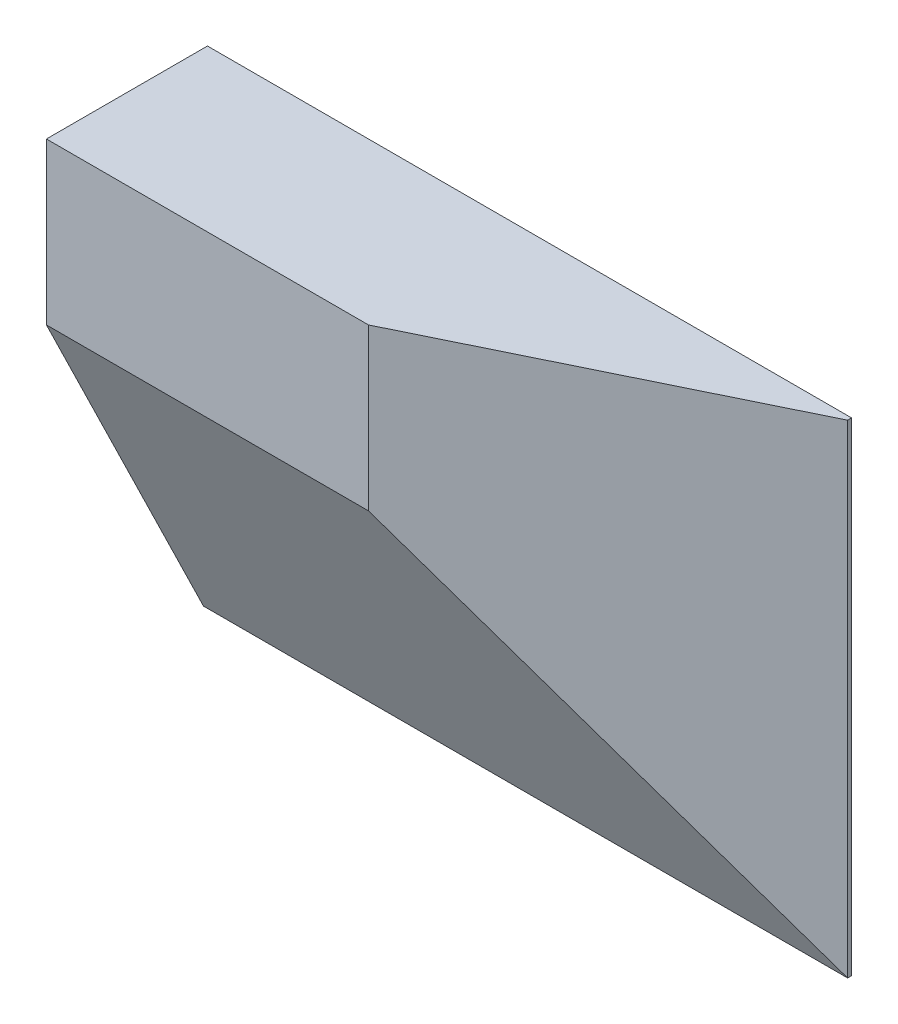
ISO-10303-21;
HEADER;
FILE_DESCRIPTION(('STEP AP214'),'2;1');
FILE_NAME('part.step','',(''),(''),'','','');
FILE_SCHEMA(('AUTOMOTIVE_DESIGN { 1 0 10303 214 1 1 1 1 }'));
ENDSEC;
DATA;
#1=APPLICATION_CONTEXT('core data for automotive mechanical design processes');
#2=APPLICATION_PROTOCOL_DEFINITION('international standard','automotive_design',2000,#1);
#3=PRODUCT_CONTEXT('',#1,'mechanical');
#4=PRODUCT('Part','Part','',(#3));
#5=PRODUCT_RELATED_PRODUCT_CATEGORY('part','',(#4));
#6=PRODUCT_DEFINITION_FORMATION('','',#4);
#7=PRODUCT_DEFINITION_CONTEXT('part definition',#1,'design');
#8=PRODUCT_DEFINITION('design','',#6,#7);
#9=PRODUCT_DEFINITION_SHAPE('','',#8);
#10=(LENGTH_UNIT() NAMED_UNIT(*) SI_UNIT(.MILLI.,.METRE.));
#11=(NAMED_UNIT(*) PLANE_ANGLE_UNIT() SI_UNIT($,.RADIAN.));
#12=(NAMED_UNIT(*) SI_UNIT($,.STERADIAN.) SOLID_ANGLE_UNIT());
#13=UNCERTAINTY_MEASURE_WITH_UNIT(LENGTH_MEASURE(1.E-05),#10,'distance_accuracy_value','');
#14=(GEOMETRIC_REPRESENTATION_CONTEXT(3) GLOBAL_UNCERTAINTY_ASSIGNED_CONTEXT((#13)) GLOBAL_UNIT_ASSIGNED_CONTEXT((#10,
#11,#12)) REPRESENTATION_CONTEXT('',''));
#15=CARTESIAN_POINT('',(0.,0.,0.));
#16=DIRECTION('',(0.,0.,1.));
#17=DIRECTION('',(1.,0.,0.));
#18=AXIS2_PLACEMENT_3D('',#15,#16,#17);
#19=CARTESIAN_POINT('',(40.,15.,5.));
#20=DIRECTION('',(0.,0.,-1.));
#21=DIRECTION('',(0.,1.,0.));
#22=AXIS2_PLACEMENT_3D('',#19,#20,#21);
#23=PLANE('',#22);
#24=DIRECTION('',(0.,-1.,0.));
#25=VECTOR('',#24,1.);
#26=CARTESIAN_POINT('',(0.,15.,5.));
#27=LINE('',#26,#25);
#28=CARTESIAN_POINT('',(0.,15.,5.));
#29=VERTEX_POINT('',#28);
#30=CARTESIAN_POINT('',(0.,5.00000000000015,5.));
#31=VERTEX_POINT('',#30);
#32=EDGE_CURVE('E119',#29,#31,#27,.T.);
#33=ORIENTED_EDGE('',*,*,#32,.T.);
#34=DIRECTION('',(1.,0.,0.));
#35=VECTOR('',#34,1.);
#36=CARTESIAN_POINT('',(40.,5.00000000000015,5.));
#37=LINE('',#36,#35);
#38=CARTESIAN_POINT('',(19.9999999999999,5.00000000000015,5.));
#39=VERTEX_POINT('',#38);
#40=EDGE_CURVE('E48',#31,#39,#37,.T.);
#41=ORIENTED_EDGE('',*,*,#40,.T.);
#42=DIRECTION('',(0.,1.,0.));
#43=VECTOR('',#42,1.);
#44=CARTESIAN_POINT('',(19.9999999999999,15.,5.));
#45=LINE('',#44,#43);
#46=CARTESIAN_POINT('',(19.9999999999999,15.,5.));
#47=VERTEX_POINT('',#46);
#48=EDGE_CURVE('E129',#39,#47,#45,.T.);
#49=ORIENTED_EDGE('',*,*,#48,.T.);
#50=DIRECTION('',(-1.,0.,0.));
#51=VECTOR('',#50,1.);
#52=CARTESIAN_POINT('',(40.,15.,5.));
#53=LINE('',#52,#51);
#54=EDGE_CURVE('E116',#47,#29,#53,.T.);
#55=ORIENTED_EDGE('',*,*,#54,.T.);
#56=EDGE_LOOP('',(#33,#41,#49,#55));
#57=FACE_BOUND('',#56,.T.);
#58=ADVANCED_FACE('F39',(#57),#23,.F.);
#59=CARTESIAN_POINT('',(40.,-15.,-5.));
#60=DIRECTION('',(0.,1.,0.));
#61=DIRECTION('',(0.,0.,1.));
#62=AXIS2_PLACEMENT_3D('',#59,#60,#61);
#63=PLANE('',#62);
#64=DIRECTION('',(0.,0.,-1.));
#65=VECTOR('',#64,1.);
#66=CARTESIAN_POINT('',(40.,-15.,-5.));
#67=LINE('',#66,#65);
#68=CARTESIAN_POINT('',(40.,-15.,-4.75465177131724));
#69=VERTEX_POINT('',#68);
#70=CARTESIAN_POINT('',(40.,-15.,-5.));
#71=VERTEX_POINT('',#70);
#72=EDGE_CURVE('E89',#69,#71,#67,.T.);
#73=ORIENTED_EDGE('',*,*,#72,.F.);
#74=DIRECTION('',(-1.,0.,0.));
#75=VECTOR('',#74,1.);
#76=CARTESIAN_POINT('',(40.,-15.,-4.75465177131724));
#77=LINE('',#76,#75);
#78=CARTESIAN_POINT('',(0.,-15.,-4.75465177131724));
#79=VERTEX_POINT('',#78);
#80=EDGE_CURVE('E133',#69,#79,#77,.T.);
#81=ORIENTED_EDGE('',*,*,#80,.T.);
#82=DIRECTION('',(0.,0.,-1.));
#83=VECTOR('',#82,1.);
#84=CARTESIAN_POINT('',(0.,-15.,-5.));
#85=LINE('',#84,#83);
#86=CARTESIAN_POINT('',(0.,-15.,-5.));
#87=VERTEX_POINT('',#86);
#88=EDGE_CURVE('E106',#79,#87,#85,.T.);
#89=ORIENTED_EDGE('',*,*,#88,.T.);
#90=DIRECTION('',(-1.,0.,0.));
#91=VECTOR('',#90,1.);
#92=CARTESIAN_POINT('',(40.,-15.,-5.));
#93=LINE('',#92,#91);
#94=EDGE_CURVE('E104',#71,#87,#93,.T.);
#95=ORIENTED_EDGE('',*,*,#94,.F.);
#96=EDGE_LOOP('',(#73,#81,#89,#95));
#97=FACE_BOUND('',#96,.T.);
#98=ADVANCED_FACE('F105',(#97),#63,.F.);
#99=CARTESIAN_POINT('',(40.,15.,-5.));
#100=DIRECTION('',(0.,0.,1.));
#101=DIRECTION('',(0.,-1.,0.));
#102=AXIS2_PLACEMENT_3D('',#99,#100,#101);
#103=PLANE('',#102);
#104=DIRECTION('',(0.,1.,0.));
#105=VECTOR('',#104,1.);
#106=CARTESIAN_POINT('',(0.,15.,-5.));
#107=LINE('',#106,#105);
#108=CARTESIAN_POINT('',(0.,15.,-5.));
#109=VERTEX_POINT('',#108);
#110=EDGE_CURVE('E122',#87,#109,#107,.T.);
#111=ORIENTED_EDGE('',*,*,#110,.T.);
#112=DIRECTION('',(-1.,0.,0.));
#113=VECTOR('',#112,1.);
#114=CARTESIAN_POINT('',(40.,15.,-5.));
#115=LINE('',#114,#113);
#116=CARTESIAN_POINT('',(40.,15.,-5.));
#117=VERTEX_POINT('',#116);
#118=EDGE_CURVE('E109',#117,#109,#115,.T.);
#119=ORIENTED_EDGE('',*,*,#118,.F.);
#120=DIRECTION('',(0.,1.,0.));
#121=VECTOR('',#120,1.);
#122=CARTESIAN_POINT('',(40.,15.,-5.));
#123=LINE('',#122,#121);
#124=EDGE_CURVE('E94',#71,#117,#123,.T.);
#125=ORIENTED_EDGE('',*,*,#124,.F.);
#126=ORIENTED_EDGE('',*,*,#94,.T.);
#127=EDGE_LOOP('',(#111,#119,#125,#126));
#128=FACE_BOUND('',#127,.T.);
#129=ADVANCED_FACE('F111',(#128),#103,.F.);
#130=CARTESIAN_POINT('',(40.,15.,-5.));
#131=DIRECTION('',(0.,-1.,0.));
#132=DIRECTION('',(0.,0.,-1.));
#133=AXIS2_PLACEMENT_3D('',#130,#131,#132);
#134=PLANE('',#133);
#135=ORIENTED_EDGE('',*,*,#54,.F.);
#136=DIRECTION('',(-0.898794046299168,0.,0.438371146789075));
#137=VECTOR('',#136,1.);
#138=CARTESIAN_POINT('',(40.,15.,-4.75465177131724));
#139=LINE('',#138,#137);
#140=CARTESIAN_POINT('',(40.,15.,-4.75465177131724));
#141=VERTEX_POINT('',#140);
#142=EDGE_CURVE('E131',#47,#141,#139,.F.);
#143=ORIENTED_EDGE('',*,*,#142,.T.);
#144=DIRECTION('',(0.,0.,1.));
#145=VECTOR('',#144,1.);
#146=CARTESIAN_POINT('',(40.,15.,-5.));
#147=LINE('',#146,#145);
#148=EDGE_CURVE('E114',#117,#141,#147,.T.);
#149=ORIENTED_EDGE('',*,*,#148,.F.);
#150=ORIENTED_EDGE('',*,*,#118,.T.);
#151=DIRECTION('',(0.,0.,1.));
#152=VECTOR('',#151,1.);
#153=CARTESIAN_POINT('',(0.,15.,-5.));
#154=LINE('',#153,#152);
#155=EDGE_CURVE('E101',#109,#29,#154,.T.);
#156=ORIENTED_EDGE('',*,*,#155,.T.);
#157=EDGE_LOOP('',(#135,#143,#149,#150,#156));
#158=FACE_BOUND('',#157,.T.);
#159=ADVANCED_FACE('F141',(#158),#134,.F.);
#160=CARTESIAN_POINT('',(40.,0.,0.));
#161=DIRECTION('',(-1.,0.,0.));
#162=DIRECTION('',(0.,0.,1.));
#163=AXIS2_PLACEMENT_3D('',#160,#161,#162);
#164=PLANE('',#163);
#165=ORIENTED_EDGE('',*,*,#148,.T.);
#166=DIRECTION('',(0.,-1.,0.));
#167=VECTOR('',#166,1.);
#168=CARTESIAN_POINT('',(40.,0.,-4.75465177131724));
#169=LINE('',#168,#167);
#170=EDGE_CURVE('E97',#141,#69,#169,.T.);
#171=ORIENTED_EDGE('',*,*,#170,.T.);
#172=ORIENTED_EDGE('',*,*,#72,.T.);
#173=ORIENTED_EDGE('',*,*,#124,.T.);
#174=EDGE_LOOP('',(#165,#171,#172,#173));
#175=FACE_BOUND('',#174,.T.);
#176=ADVANCED_FACE('F92',(#175),#164,.F.);
#177=CARTESIAN_POINT('',(0.,0.,0.));
#178=DIRECTION('',(-1.,0.,0.));
#179=DIRECTION('',(0.,0.,1.));
#180=AXIS2_PLACEMENT_3D('',#177,#178,#179);
#181=PLANE('',#180);
#182=ORIENTED_EDGE('',*,*,#88,.F.);
#183=DIRECTION('',(0.,-0.898794046299168,-0.438371146789075));
#184=VECTOR('',#183,1.);
#185=CARTESIAN_POINT('',(0.,-1.00918057233092,2.0691268042973));
#186=LINE('',#185,#184);
#187=EDGE_CURVE('E62',#79,#31,#186,.F.);
#188=ORIENTED_EDGE('',*,*,#187,.T.);
#189=ORIENTED_EDGE('',*,*,#32,.F.);
#190=ORIENTED_EDGE('',*,*,#155,.F.);
#191=ORIENTED_EDGE('',*,*,#110,.F.);
#192=EDGE_LOOP('',(#182,#188,#189,#190,#191));
#193=FACE_BOUND('',#192,.T.);
#194=ADVANCED_FACE('F137',(#193),#181,.T.);
#195=CARTESIAN_POINT('',(40.,0.,-4.75465177131724));
#196=DIRECTION('',(-0.438371146789075,0.,-0.898794046299168));
#197=DIRECTION('',(0.,-1.,0.));
#198=AXIS2_PLACEMENT_3D('',#195,#196,#197);
#199=PLANE('',#198);
#200=ORIENTED_EDGE('',*,*,#48,.F.);
#201=DIRECTION('',(0.668469049282115,-0.668469049282115,-0.326034139782524));
#202=VECTOR('',#201,1.);
#203=CARTESIAN_POINT('',(33.297236952278,-8.29723695227798,-1.48549579950819));
#204=LINE('',#203,#202);
#205=EDGE_CURVE('E11',#39,#69,#204,.T.);
#206=ORIENTED_EDGE('',*,*,#205,.T.);
#207=ORIENTED_EDGE('',*,*,#170,.F.);
#208=ORIENTED_EDGE('',*,*,#142,.F.);
#209=EDGE_LOOP('',(#200,#206,#207,#208));
#210=FACE_BOUND('',#209,.T.);
#211=ADVANCED_FACE('F144',(#210),#199,.F.);
#212=CARTESIAN_POINT('',(40.,-15.,-4.75465177131724));
#213=DIRECTION('',(0.,0.438371146789075,-0.898794046299168));
#214=DIRECTION('',(-1.,0.,0.));
#215=AXIS2_PLACEMENT_3D('',#212,#213,#214);
#216=PLANE('',#215);
#217=ORIENTED_EDGE('',*,*,#205,.F.);
#218=ORIENTED_EDGE('',*,*,#40,.F.);
#219=ORIENTED_EDGE('',*,*,#187,.F.);
#220=ORIENTED_EDGE('',*,*,#80,.F.);
#221=EDGE_LOOP('',(#217,#218,#219,#220));
#222=FACE_BOUND('',#221,.T.);
#223=ADVANCED_FACE('F42',(#222),#216,.F.);
#224=CLOSED_SHELL('',(#58,#98,#129,#159,#176,#194,#211,#223));
#225=MANIFOLD_SOLID_BREP('B2',#224);
#226=ADVANCED_BREP_SHAPE_REPRESENTATION('',(#18,#225),#14);
#227=SHAPE_DEFINITION_REPRESENTATION(#9,#226);
ENDSEC;
END-ISO-10303-21;
